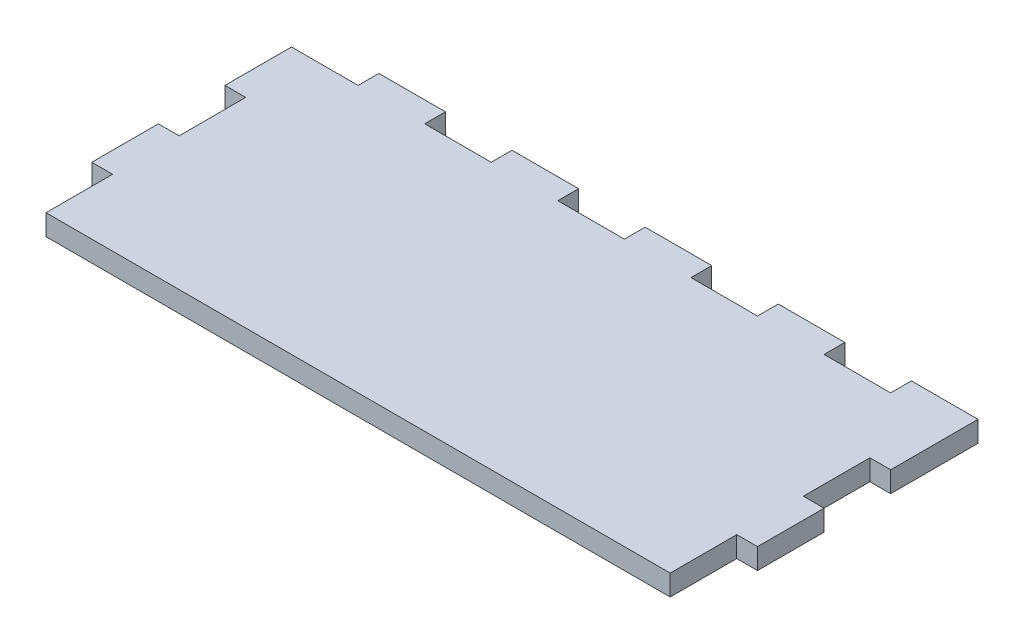
ISO-10303-21;
HEADER;
FILE_DESCRIPTION(('STEP AP214'),'2;1');
FILE_NAME('part.step','',(''),(''),'','','');
FILE_SCHEMA(('AUTOMOTIVE_DESIGN { 1 0 10303 214 1 1 1 1 }'));
ENDSEC;
DATA;
#1=APPLICATION_CONTEXT('core data for automotive mechanical design processes');
#2=APPLICATION_PROTOCOL_DEFINITION('international standard','automotive_design',2000,#1);
#3=PRODUCT_CONTEXT('',#1,'mechanical');
#4=PRODUCT('Part','Part','',(#3));
#5=PRODUCT_RELATED_PRODUCT_CATEGORY('part','',(#4));
#6=PRODUCT_DEFINITION_FORMATION('','',#4);
#7=PRODUCT_DEFINITION_CONTEXT('part definition',#1,'design');
#8=PRODUCT_DEFINITION('design','',#6,#7);
#9=PRODUCT_DEFINITION_SHAPE('','',#8);
#10=(LENGTH_UNIT() NAMED_UNIT(*) SI_UNIT(.MILLI.,.METRE.));
#11=(NAMED_UNIT(*) PLANE_ANGLE_UNIT() SI_UNIT($,.RADIAN.));
#12=(NAMED_UNIT(*) SI_UNIT($,.STERADIAN.) SOLID_ANGLE_UNIT());
#13=UNCERTAINTY_MEASURE_WITH_UNIT(LENGTH_MEASURE(1.E-05),#10,'distance_accuracy_value','');
#14=(GEOMETRIC_REPRESENTATION_CONTEXT(3) GLOBAL_UNCERTAINTY_ASSIGNED_CONTEXT((#13)) GLOBAL_UNIT_ASSIGNED_CONTEXT((#10,
#11,#12)) REPRESENTATION_CONTEXT('',''));
#15=CARTESIAN_POINT('',(0.,0.,0.));
#16=DIRECTION('',(0.,0.,1.));
#17=DIRECTION('',(1.,0.,0.));
#18=AXIS2_PLACEMENT_3D('',#15,#16,#17);
#19=CARTESIAN_POINT('',(0.,3.12,3.12));
#20=DIRECTION('',(-1.,0.,0.));
#21=DIRECTION('',(0.,0.,1.));
#22=AXIS2_PLACEMENT_3D('',#19,#20,#21);
#23=PLANE('',#22);
#24=DIRECTION('',(0.,0.,-1.));
#25=VECTOR('',#24,1.);
#26=CARTESIAN_POINT('',(0.,0.,3.12));
#27=LINE('',#26,#25);
#28=CARTESIAN_POINT('',(0.,0.,13.12));
#29=VERTEX_POINT('',#28);
#30=CARTESIAN_POINT('',(0.,0.,3.12));
#31=VERTEX_POINT('',#30);
#32=EDGE_CURVE('E285',#29,#31,#27,.T.);
#33=ORIENTED_EDGE('',*,*,#32,.F.);
#34=DIRECTION('',(0.,-1.,0.));
#35=VECTOR('',#34,1.);
#36=CARTESIAN_POINT('',(0.,3.12,13.12));
#37=LINE('',#36,#35);
#38=CARTESIAN_POINT('',(0.,3.12,13.12));
#39=VERTEX_POINT('',#38);
#40=EDGE_CURVE('E11',#39,#29,#37,.T.);
#41=ORIENTED_EDGE('',*,*,#40,.F.);
#42=DIRECTION('',(0.,0.,-1.));
#43=VECTOR('',#42,1.);
#44=CARTESIAN_POINT('',(0.,3.12,3.12));
#45=LINE('',#44,#43);
#46=CARTESIAN_POINT('',(0.,3.12,3.12));
#47=VERTEX_POINT('',#46);
#48=EDGE_CURVE('E383',#39,#47,#45,.T.);
#49=ORIENTED_EDGE('',*,*,#48,.T.);
#50=DIRECTION('',(0.,-1.,0.));
#51=VECTOR('',#50,1.);
#52=CARTESIAN_POINT('',(0.,3.12,3.12));
#53=LINE('',#52,#51);
#54=EDGE_CURVE('E35',#47,#31,#53,.T.);
#55=ORIENTED_EDGE('',*,*,#54,.T.);
#56=EDGE_LOOP('',(#33,#41,#49,#55));
#57=FACE_BOUND('',#56,.T.);
#58=ADVANCED_FACE('F32',(#57),#23,.T.);
#59=CARTESIAN_POINT('',(0.,3.12,13.12));
#60=DIRECTION('',(0.,0.,1.));
#61=DIRECTION('',(1.,0.,0.));
#62=AXIS2_PLACEMENT_3D('',#59,#60,#61);
#63=PLANE('',#62);
#64=DIRECTION('',(-1.,0.,0.));
#65=VECTOR('',#64,1.);
#66=CARTESIAN_POINT('',(0.,0.,13.12));
#67=LINE('',#66,#65);
#68=CARTESIAN_POINT('',(3.12,0.,13.12));
#69=VERTEX_POINT('',#68);
#70=EDGE_CURVE('E381',#69,#29,#67,.T.);
#71=ORIENTED_EDGE('',*,*,#70,.F.);
#72=DIRECTION('',(0.,-1.,0.));
#73=VECTOR('',#72,1.);
#74=CARTESIAN_POINT('',(3.12,3.12,13.12));
#75=LINE('',#74,#73);
#76=CARTESIAN_POINT('',(3.12,3.12,13.12));
#77=VERTEX_POINT('',#76);
#78=EDGE_CURVE('E41',#77,#69,#75,.T.);
#79=ORIENTED_EDGE('',*,*,#78,.F.);
#80=DIRECTION('',(-1.,0.,0.));
#81=VECTOR('',#80,1.);
#82=CARTESIAN_POINT('',(0.,3.12,13.12));
#83=LINE('',#82,#81);
#84=EDGE_CURVE('E275',#77,#39,#83,.T.);
#85=ORIENTED_EDGE('',*,*,#84,.T.);
#86=ORIENTED_EDGE('',*,*,#40,.T.);
#87=EDGE_LOOP('',(#71,#79,#85,#86));
#88=FACE_BOUND('',#87,.T.);
#89=ADVANCED_FACE('F448',(#88),#63,.T.);
#90=CARTESIAN_POINT('',(3.12,3.12,13.12));
#91=DIRECTION('',(-1.,0.,0.));
#92=DIRECTION('',(0.,0.,1.));
#93=AXIS2_PLACEMENT_3D('',#90,#91,#92);
#94=PLANE('',#93);
#95=DIRECTION('',(0.,0.,-1.));
#96=VECTOR('',#95,1.);
#97=CARTESIAN_POINT('',(3.12,0.,13.12));
#98=LINE('',#97,#96);
#99=CARTESIAN_POINT('',(3.12,0.,23.12));
#100=VERTEX_POINT('',#99);
#101=EDGE_CURVE('E262',#100,#69,#98,.T.);
#102=ORIENTED_EDGE('',*,*,#101,.F.);
#103=DIRECTION('',(0.,-1.,0.));
#104=VECTOR('',#103,1.);
#105=CARTESIAN_POINT('',(3.12,3.12,23.12));
#106=LINE('',#105,#104);
#107=CARTESIAN_POINT('',(3.12,3.12,23.12));
#108=VERTEX_POINT('',#107);
#109=EDGE_CURVE('E257',#108,#100,#106,.T.);
#110=ORIENTED_EDGE('',*,*,#109,.F.);
#111=DIRECTION('',(0.,0.,-1.));
#112=VECTOR('',#111,1.);
#113=CARTESIAN_POINT('',(3.12,3.12,13.12));
#114=LINE('',#113,#112);
#115=EDGE_CURVE('E260',#108,#77,#114,.T.);
#116=ORIENTED_EDGE('',*,*,#115,.T.);
#117=ORIENTED_EDGE('',*,*,#78,.T.);
#118=EDGE_LOOP('',(#102,#110,#116,#117));
#119=FACE_BOUND('',#118,.T.);
#120=ADVANCED_FACE('F259',(#119),#94,.T.);
#121=CARTESIAN_POINT('',(3.12,3.12,23.12));
#122=DIRECTION('',(0.,0.,-1.));
#123=DIRECTION('',(-1.,0.,0.));
#124=AXIS2_PLACEMENT_3D('',#121,#122,#123);
#125=PLANE('',#124);
#126=DIRECTION('',(1.,0.,0.));
#127=VECTOR('',#126,1.);
#128=CARTESIAN_POINT('',(3.12,0.,23.12));
#129=LINE('',#128,#127);
#130=CARTESIAN_POINT('',(0.,0.,23.12));
#131=VERTEX_POINT('',#130);
#132=EDGE_CURVE('E378',#131,#100,#129,.T.);
#133=ORIENTED_EDGE('',*,*,#132,.F.);
#134=DIRECTION('',(0.,-1.,0.));
#135=VECTOR('',#134,1.);
#136=CARTESIAN_POINT('',(0.,3.12,23.12));
#137=LINE('',#136,#135);
#138=CARTESIAN_POINT('',(0.,3.12,23.12));
#139=VERTEX_POINT('',#138);
#140=EDGE_CURVE('E267',#139,#131,#137,.T.);
#141=ORIENTED_EDGE('',*,*,#140,.F.);
#142=DIRECTION('',(1.,0.,0.));
#143=VECTOR('',#142,1.);
#144=CARTESIAN_POINT('',(3.12,3.12,23.12));
#145=LINE('',#144,#143);
#146=EDGE_CURVE('E273',#139,#108,#145,.T.);
#147=ORIENTED_EDGE('',*,*,#146,.T.);
#148=ORIENTED_EDGE('',*,*,#109,.T.);
#149=EDGE_LOOP('',(#133,#141,#147,#148));
#150=FACE_BOUND('',#149,.T.);
#151=ADVANCED_FACE('F277',(#150),#125,.T.);
#152=CARTESIAN_POINT('',(0.,3.12,23.12));
#153=DIRECTION('',(-1.,0.,0.));
#154=DIRECTION('',(0.,0.,1.));
#155=AXIS2_PLACEMENT_3D('',#152,#153,#154);
#156=PLANE('',#155);
#157=DIRECTION('',(0.,0.,-1.));
#158=VECTOR('',#157,1.);
#159=CARTESIAN_POINT('',(0.,0.,23.12));
#160=LINE('',#159,#158);
#161=CARTESIAN_POINT('',(0.,0.,33.12));
#162=VERTEX_POINT('',#161);
#163=EDGE_CURVE('E375',#162,#131,#160,.T.);
#164=ORIENTED_EDGE('',*,*,#163,.F.);
#165=DIRECTION('',(0.,-1.,0.));
#166=VECTOR('',#165,1.);
#167=CARTESIAN_POINT('',(0.,3.12,33.12));
#168=LINE('',#167,#166);
#169=CARTESIAN_POINT('',(0.,3.12,33.12));
#170=VERTEX_POINT('',#169);
#171=EDGE_CURVE('E387',#170,#162,#168,.T.);
#172=ORIENTED_EDGE('',*,*,#171,.F.);
#173=DIRECTION('',(0.,0.,-1.));
#174=VECTOR('',#173,1.);
#175=CARTESIAN_POINT('',(0.,3.12,23.12));
#176=LINE('',#175,#174);
#177=EDGE_CURVE('E278',#170,#139,#176,.T.);
#178=ORIENTED_EDGE('',*,*,#177,.T.);
#179=ORIENTED_EDGE('',*,*,#140,.T.);
#180=EDGE_LOOP('',(#164,#172,#178,#179));
#181=FACE_BOUND('',#180,.T.);
#182=ADVANCED_FACE('F461',(#181),#156,.T.);
#183=CARTESIAN_POINT('',(0.,3.12,33.12));
#184=DIRECTION('',(0.,0.,1.));
#185=DIRECTION('',(1.,0.,0.));
#186=AXIS2_PLACEMENT_3D('',#183,#184,#185);
#187=PLANE('',#186);
#188=DIRECTION('',(-1.,0.,0.));
#189=VECTOR('',#188,1.);
#190=CARTESIAN_POINT('',(0.,0.,33.12));
#191=LINE('',#190,#189);
#192=CARTESIAN_POINT('',(3.12,0.,33.12));
#193=VERTEX_POINT('',#192);
#194=EDGE_CURVE('E372',#193,#162,#191,.T.);
#195=ORIENTED_EDGE('',*,*,#194,.F.);
#196=DIRECTION('',(0.,-1.,0.));
#197=VECTOR('',#196,1.);
#198=CARTESIAN_POINT('',(3.12,3.12,33.12));
#199=LINE('',#198,#197);
#200=CARTESIAN_POINT('',(3.12,3.12,33.12));
#201=VERTEX_POINT('',#200);
#202=EDGE_CURVE('E389',#201,#193,#199,.T.);
#203=ORIENTED_EDGE('',*,*,#202,.F.);
#204=DIRECTION('',(-1.,0.,0.));
#205=VECTOR('',#204,1.);
#206=CARTESIAN_POINT('',(0.,3.12,33.12));
#207=LINE('',#206,#205);
#208=EDGE_CURVE('E280',#201,#170,#207,.T.);
#209=ORIENTED_EDGE('',*,*,#208,.T.);
#210=ORIENTED_EDGE('',*,*,#171,.T.);
#211=EDGE_LOOP('',(#195,#203,#209,#210));
#212=FACE_BOUND('',#211,.T.);
#213=ADVANCED_FACE('F464',(#212),#187,.T.);
#214=CARTESIAN_POINT('',(3.12,3.12,33.12));
#215=DIRECTION('',(-1.,0.,0.));
#216=DIRECTION('',(0.,0.,1.));
#217=AXIS2_PLACEMENT_3D('',#214,#215,#216);
#218=PLANE('',#217);
#219=DIRECTION('',(0.,0.,-1.));
#220=VECTOR('',#219,1.);
#221=CARTESIAN_POINT('',(3.12,0.,33.12));
#222=LINE('',#221,#220);
#223=CARTESIAN_POINT('',(3.12,0.,43.12));
#224=VERTEX_POINT('',#223);
#225=EDGE_CURVE('E369',#224,#193,#222,.T.);
#226=ORIENTED_EDGE('',*,*,#225,.F.);
#227=DIRECTION('',(0.,-1.,0.));
#228=VECTOR('',#227,1.);
#229=CARTESIAN_POINT('',(3.12,3.12,43.12));
#230=LINE('',#229,#228);
#231=CARTESIAN_POINT('',(3.12,3.12,43.12));
#232=VERTEX_POINT('',#231);
#233=EDGE_CURVE('E391',#232,#224,#230,.T.);
#234=ORIENTED_EDGE('',*,*,#233,.F.);
#235=DIRECTION('',(0.,0.,-1.));
#236=VECTOR('',#235,1.);
#237=CARTESIAN_POINT('',(3.12,3.12,33.12));
#238=LINE('',#237,#236);
#239=EDGE_CURVE('E891',#232,#201,#238,.T.);
#240=ORIENTED_EDGE('',*,*,#239,.T.);
#241=ORIENTED_EDGE('',*,*,#202,.T.);
#242=EDGE_LOOP('',(#226,#234,#240,#241));
#243=FACE_BOUND('',#242,.T.);
#244=ADVANCED_FACE('F468',(#243),#218,.T.);
#245=CARTESIAN_POINT('',(3.12,3.12,43.12));
#246=DIRECTION('',(0.,0.,1.));
#247=DIRECTION('',(1.,0.,0.));
#248=AXIS2_PLACEMENT_3D('',#245,#246,#247);
#249=PLANE('',#248);
#250=DIRECTION('',(-1.,0.,0.));
#251=VECTOR('',#250,1.);
#252=CARTESIAN_POINT('',(3.12,0.,43.12));
#253=LINE('',#252,#251);
#254=CARTESIAN_POINT('',(96.88,0.,43.12));
#255=VERTEX_POINT('',#254);
#256=EDGE_CURVE('E366',#255,#224,#253,.T.);
#257=ORIENTED_EDGE('',*,*,#256,.F.);
#258=DIRECTION('',(0.,-1.,0.));
#259=VECTOR('',#258,1.);
#260=CARTESIAN_POINT('',(96.88,3.12,43.12));
#261=LINE('',#260,#259);
#262=CARTESIAN_POINT('',(96.88,3.12,43.12));
#263=VERTEX_POINT('',#262);
#264=EDGE_CURVE('E393',#263,#255,#261,.T.);
#265=ORIENTED_EDGE('',*,*,#264,.F.);
#266=DIRECTION('',(-1.,0.,0.));
#267=VECTOR('',#266,1.);
#268=CARTESIAN_POINT('',(3.12,3.12,43.12));
#269=LINE('',#268,#267);
#270=EDGE_CURVE('E888',#263,#232,#269,.T.);
#271=ORIENTED_EDGE('',*,*,#270,.T.);
#272=ORIENTED_EDGE('',*,*,#233,.T.);
#273=EDGE_LOOP('',(#257,#265,#271,#272));
#274=FACE_BOUND('',#273,.T.);
#275=ADVANCED_FACE('F472',(#274),#249,.T.);
#276=CARTESIAN_POINT('',(96.88,3.12,33.12));
#277=DIRECTION('',(1.,0.,0.));
#278=DIRECTION('',(0.,0.,-1.));
#279=AXIS2_PLACEMENT_3D('',#276,#277,#278);
#280=PLANE('',#279);
#281=DIRECTION('',(0.,0.,1.));
#282=VECTOR('',#281,1.);
#283=CARTESIAN_POINT('',(96.88,0.,33.12));
#284=LINE('',#283,#282);
#285=CARTESIAN_POINT('',(96.88,0.,33.12));
#286=VERTEX_POINT('',#285);
#287=EDGE_CURVE('E363',#286,#255,#284,.T.);
#288=ORIENTED_EDGE('',*,*,#287,.F.);
#289=DIRECTION('',(0.,-1.,0.));
#290=VECTOR('',#289,1.);
#291=CARTESIAN_POINT('',(96.88,3.12,33.12));
#292=LINE('',#291,#290);
#293=CARTESIAN_POINT('',(96.88,3.12,33.12));
#294=VERTEX_POINT('',#293);
#295=EDGE_CURVE('E395',#294,#286,#292,.T.);
#296=ORIENTED_EDGE('',*,*,#295,.F.);
#297=DIRECTION('',(0.,0.,1.));
#298=VECTOR('',#297,1.);
#299=CARTESIAN_POINT('',(96.88,3.12,33.12));
#300=LINE('',#299,#298);
#301=EDGE_CURVE('E885',#294,#263,#300,.T.);
#302=ORIENTED_EDGE('',*,*,#301,.T.);
#303=ORIENTED_EDGE('',*,*,#264,.T.);
#304=EDGE_LOOP('',(#288,#296,#302,#303));
#305=FACE_BOUND('',#304,.T.);
#306=ADVANCED_FACE('F476',(#305),#280,.T.);
#307=CARTESIAN_POINT('',(100.,3.12,33.12));
#308=DIRECTION('',(0.,0.,1.));
#309=DIRECTION('',(1.,0.,0.));
#310=AXIS2_PLACEMENT_3D('',#307,#308,#309);
#311=PLANE('',#310);
#312=DIRECTION('',(-1.,0.,0.));
#313=VECTOR('',#312,1.);
#314=CARTESIAN_POINT('',(100.,0.,33.12));
#315=LINE('',#314,#313);
#316=CARTESIAN_POINT('',(100.,0.,33.12));
#317=VERTEX_POINT('',#316);
#318=EDGE_CURVE('E360',#317,#286,#315,.T.);
#319=ORIENTED_EDGE('',*,*,#318,.F.);
#320=DIRECTION('',(0.,-1.,0.));
#321=VECTOR('',#320,1.);
#322=CARTESIAN_POINT('',(100.,3.12,33.12));
#323=LINE('',#322,#321);
#324=CARTESIAN_POINT('',(100.,3.12,33.12));
#325=VERTEX_POINT('',#324);
#326=EDGE_CURVE('E397',#325,#317,#323,.T.);
#327=ORIENTED_EDGE('',*,*,#326,.F.);
#328=DIRECTION('',(-1.,0.,0.));
#329=VECTOR('',#328,1.);
#330=CARTESIAN_POINT('',(100.,3.12,33.12));
#331=LINE('',#330,#329);
#332=EDGE_CURVE('E882',#325,#294,#331,.T.);
#333=ORIENTED_EDGE('',*,*,#332,.T.);
#334=ORIENTED_EDGE('',*,*,#295,.T.);
#335=EDGE_LOOP('',(#319,#327,#333,#334));
#336=FACE_BOUND('',#335,.T.);
#337=ADVANCED_FACE('F480',(#336),#311,.T.);
#338=CARTESIAN_POINT('',(100.,3.12,23.12));
#339=DIRECTION('',(1.,0.,0.));
#340=DIRECTION('',(0.,0.,-1.));
#341=AXIS2_PLACEMENT_3D('',#338,#339,#340);
#342=PLANE('',#341);
#343=DIRECTION('',(0.,0.,1.));
#344=VECTOR('',#343,1.);
#345=CARTESIAN_POINT('',(100.,0.,23.12));
#346=LINE('',#345,#344);
#347=CARTESIAN_POINT('',(100.,0.,23.12));
#348=VERTEX_POINT('',#347);
#349=EDGE_CURVE('E357',#348,#317,#346,.T.);
#350=ORIENTED_EDGE('',*,*,#349,.F.);
#351=DIRECTION('',(0.,-1.,0.));
#352=VECTOR('',#351,1.);
#353=CARTESIAN_POINT('',(100.,3.12,23.12));
#354=LINE('',#353,#352);
#355=CARTESIAN_POINT('',(100.,3.12,23.12));
#356=VERTEX_POINT('',#355);
#357=EDGE_CURVE('E399',#356,#348,#354,.T.);
#358=ORIENTED_EDGE('',*,*,#357,.F.);
#359=DIRECTION('',(0.,0.,1.));
#360=VECTOR('',#359,1.);
#361=CARTESIAN_POINT('',(100.,3.12,23.12));
#362=LINE('',#361,#360);
#363=EDGE_CURVE('E879',#356,#325,#362,.T.);
#364=ORIENTED_EDGE('',*,*,#363,.T.);
#365=ORIENTED_EDGE('',*,*,#326,.T.);
#366=EDGE_LOOP('',(#350,#358,#364,#365));
#367=FACE_BOUND('',#366,.T.);
#368=ADVANCED_FACE('F484',(#367),#342,.T.);
#369=CARTESIAN_POINT('',(96.88,3.12,23.12));
#370=DIRECTION('',(0.,0.,-1.));
#371=DIRECTION('',(-1.,0.,0.));
#372=AXIS2_PLACEMENT_3D('',#369,#370,#371);
#373=PLANE('',#372);
#374=DIRECTION('',(1.,0.,0.));
#375=VECTOR('',#374,1.);
#376=CARTESIAN_POINT('',(96.88,0.,23.12));
#377=LINE('',#376,#375);
#378=CARTESIAN_POINT('',(96.88,0.,23.12));
#379=VERTEX_POINT('',#378);
#380=EDGE_CURVE('E354',#379,#348,#377,.T.);
#381=ORIENTED_EDGE('',*,*,#380,.F.);
#382=DIRECTION('',(0.,-1.,0.));
#383=VECTOR('',#382,1.);
#384=CARTESIAN_POINT('',(96.88,3.12,23.12));
#385=LINE('',#384,#383);
#386=CARTESIAN_POINT('',(96.88,3.12,23.12));
#387=VERTEX_POINT('',#386);
#388=EDGE_CURVE('E401',#387,#379,#385,.T.);
#389=ORIENTED_EDGE('',*,*,#388,.F.);
#390=DIRECTION('',(1.,0.,0.));
#391=VECTOR('',#390,1.);
#392=CARTESIAN_POINT('',(96.88,3.12,23.12));
#393=LINE('',#392,#391);
#394=EDGE_CURVE('E876',#387,#356,#393,.T.);
#395=ORIENTED_EDGE('',*,*,#394,.T.);
#396=ORIENTED_EDGE('',*,*,#357,.T.);
#397=EDGE_LOOP('',(#381,#389,#395,#396));
#398=FACE_BOUND('',#397,.T.);
#399=ADVANCED_FACE('F488',(#398),#373,.T.);
#400=CARTESIAN_POINT('',(96.88,3.12,13.12));
#401=DIRECTION('',(1.,0.,0.));
#402=DIRECTION('',(0.,0.,-1.));
#403=AXIS2_PLACEMENT_3D('',#400,#401,#402);
#404=PLANE('',#403);
#405=DIRECTION('',(0.,0.,1.));
#406=VECTOR('',#405,1.);
#407=CARTESIAN_POINT('',(96.88,0.,13.12));
#408=LINE('',#407,#406);
#409=CARTESIAN_POINT('',(96.88,0.,13.12));
#410=VERTEX_POINT('',#409);
#411=EDGE_CURVE('E351',#410,#379,#408,.T.);
#412=ORIENTED_EDGE('',*,*,#411,.F.);
#413=DIRECTION('',(0.,-1.,0.));
#414=VECTOR('',#413,1.);
#415=CARTESIAN_POINT('',(96.88,3.12,13.12));
#416=LINE('',#415,#414);
#417=CARTESIAN_POINT('',(96.88,3.12,13.12));
#418=VERTEX_POINT('',#417);
#419=EDGE_CURVE('E403',#418,#410,#416,.T.);
#420=ORIENTED_EDGE('',*,*,#419,.F.);
#421=DIRECTION('',(0.,0.,1.));
#422=VECTOR('',#421,1.);
#423=CARTESIAN_POINT('',(96.88,3.12,13.12));
#424=LINE('',#423,#422);
#425=EDGE_CURVE('E869',#418,#387,#424,.T.);
#426=ORIENTED_EDGE('',*,*,#425,.T.);
#427=ORIENTED_EDGE('',*,*,#388,.T.);
#428=EDGE_LOOP('',(#412,#420,#426,#427));
#429=FACE_BOUND('',#428,.T.);
#430=ADVANCED_FACE('F492',(#429),#404,.T.);
#431=CARTESIAN_POINT('',(100.,3.12,13.12));
#432=DIRECTION('',(0.,0.,1.));
#433=DIRECTION('',(1.,0.,0.));
#434=AXIS2_PLACEMENT_3D('',#431,#432,#433);
#435=PLANE('',#434);
#436=DIRECTION('',(-1.,0.,0.));
#437=VECTOR('',#436,1.);
#438=CARTESIAN_POINT('',(100.,0.,13.12));
#439=LINE('',#438,#437);
#440=CARTESIAN_POINT('',(100.,0.,13.12));
#441=VERTEX_POINT('',#440);
#442=EDGE_CURVE('E348',#441,#410,#439,.T.);
#443=ORIENTED_EDGE('',*,*,#442,.F.);
#444=DIRECTION('',(0.,-1.,0.));
#445=VECTOR('',#444,1.);
#446=CARTESIAN_POINT('',(100.,3.12,13.12));
#447=LINE('',#446,#445);
#448=CARTESIAN_POINT('',(100.,3.12,13.12));
#449=VERTEX_POINT('',#448);
#450=EDGE_CURVE('E405',#449,#441,#447,.T.);
#451=ORIENTED_EDGE('',*,*,#450,.F.);
#452=DIRECTION('',(-1.,0.,0.));
#453=VECTOR('',#452,1.);
#454=CARTESIAN_POINT('',(100.,3.12,13.12));
#455=LINE('',#454,#453);
#456=EDGE_CURVE('E867',#449,#418,#455,.T.);
#457=ORIENTED_EDGE('',*,*,#456,.T.);
#458=ORIENTED_EDGE('',*,*,#419,.T.);
#459=EDGE_LOOP('',(#443,#451,#457,#458));
#460=FACE_BOUND('',#459,.T.);
#461=ADVANCED_FACE('F496',(#460),#435,.T.);
#462=CARTESIAN_POINT('',(100.,3.12,3.12));
#463=DIRECTION('',(1.,0.,0.));
#464=DIRECTION('',(0.,0.,-1.));
#465=AXIS2_PLACEMENT_3D('',#462,#463,#464);
#466=PLANE('',#465);
#467=DIRECTION('',(0.,0.,1.));
#468=VECTOR('',#467,1.);
#469=CARTESIAN_POINT('',(100.,0.,3.12));
#470=LINE('',#469,#468);
#471=CARTESIAN_POINT('',(100.,0.,0.));
#472=VERTEX_POINT('',#471);
#473=EDGE_CURVE('E345',#472,#441,#470,.T.);
#474=ORIENTED_EDGE('',*,*,#473,.F.);
#475=DIRECTION('',(0.,-1.,0.));
#476=VECTOR('',#475,1.);
#477=CARTESIAN_POINT('',(100.,3.12,0.));
#478=LINE('',#477,#476);
#479=CARTESIAN_POINT('',(100.,3.12,0.));
#480=VERTEX_POINT('',#479);
#481=EDGE_CURVE('E407',#480,#472,#478,.T.);
#482=ORIENTED_EDGE('',*,*,#481,.F.);
#483=DIRECTION('',(0.,0.,1.));
#484=VECTOR('',#483,1.);
#485=CARTESIAN_POINT('',(100.,3.12,0.));
#486=LINE('',#485,#484);
#487=EDGE_CURVE('E862',#480,#449,#486,.T.);
#488=ORIENTED_EDGE('',*,*,#487,.T.);
#489=ORIENTED_EDGE('',*,*,#450,.T.);
#490=EDGE_LOOP('',(#474,#482,#488,#489));
#491=FACE_BOUND('',#490,.T.);
#492=ADVANCED_FACE('F500',(#491),#466,.T.);
#493=CARTESIAN_POINT('',(90.,3.12,0.));
#494=DIRECTION('',(0.,0.,-1.));
#495=DIRECTION('',(-1.,0.,0.));
#496=AXIS2_PLACEMENT_3D('',#493,#494,#495);
#497=PLANE('',#496);
#498=DIRECTION('',(1.,0.,0.));
#499=VECTOR('',#498,1.);
#500=CARTESIAN_POINT('',(90.,0.,0.));
#501=LINE('',#500,#499);
#502=CARTESIAN_POINT('',(90.,0.,0.));
#503=VERTEX_POINT('',#502);
#504=EDGE_CURVE('E342',#503,#472,#501,.T.);
#505=ORIENTED_EDGE('',*,*,#504,.F.);
#506=DIRECTION('',(0.,-1.,0.));
#507=VECTOR('',#506,1.);
#508=CARTESIAN_POINT('',(90.,3.12,0.));
#509=LINE('',#508,#507);
#510=CARTESIAN_POINT('',(90.,3.12,0.));
#511=VERTEX_POINT('',#510);
#512=EDGE_CURVE('E410',#511,#503,#509,.T.);
#513=ORIENTED_EDGE('',*,*,#512,.F.);
#514=DIRECTION('',(1.,0.,0.));
#515=VECTOR('',#514,1.);
#516=CARTESIAN_POINT('',(90.,3.12,0.));
#517=LINE('',#516,#515);
#518=EDGE_CURVE('E860',#511,#480,#517,.T.);
#519=ORIENTED_EDGE('',*,*,#518,.T.);
#520=ORIENTED_EDGE('',*,*,#481,.T.);
#521=EDGE_LOOP('',(#505,#513,#519,#520));
#522=FACE_BOUND('',#521,.T.);
#523=ADVANCED_FACE('F504',(#522),#497,.T.);
#524=CARTESIAN_POINT('',(90.,3.12,3.12));
#525=DIRECTION('',(-1.,0.,0.));
#526=DIRECTION('',(0.,0.,1.));
#527=AXIS2_PLACEMENT_3D('',#524,#525,#526);
#528=PLANE('',#527);
#529=DIRECTION('',(0.,0.,-1.));
#530=VECTOR('',#529,1.);
#531=CARTESIAN_POINT('',(90.,0.,3.12));
#532=LINE('',#531,#530);
#533=CARTESIAN_POINT('',(90.,0.,3.12));
#534=VERTEX_POINT('',#533);
#535=EDGE_CURVE('E339',#534,#503,#532,.T.);
#536=ORIENTED_EDGE('',*,*,#535,.F.);
#537=DIRECTION('',(0.,-1.,0.));
#538=VECTOR('',#537,1.);
#539=CARTESIAN_POINT('',(90.,3.12,3.12));
#540=LINE('',#539,#538);
#541=CARTESIAN_POINT('',(90.,3.12,3.12));
#542=VERTEX_POINT('',#541);
#543=EDGE_CURVE('E412',#542,#534,#540,.T.);
#544=ORIENTED_EDGE('',*,*,#543,.F.);
#545=DIRECTION('',(0.,0.,-1.));
#546=VECTOR('',#545,1.);
#547=CARTESIAN_POINT('',(90.,3.12,3.12));
#548=LINE('',#547,#546);
#549=EDGE_CURVE('E857',#542,#511,#548,.T.);
#550=ORIENTED_EDGE('',*,*,#549,.T.);
#551=ORIENTED_EDGE('',*,*,#512,.T.);
#552=EDGE_LOOP('',(#536,#544,#550,#551));
#553=FACE_BOUND('',#552,.T.);
#554=ADVANCED_FACE('F508',(#553),#528,.T.);
#555=CARTESIAN_POINT('',(80.,3.12,3.12));
#556=DIRECTION('',(0.,0.,-1.));
#557=DIRECTION('',(-1.,0.,0.));
#558=AXIS2_PLACEMENT_3D('',#555,#556,#557);
#559=PLANE('',#558);
#560=DIRECTION('',(1.,0.,0.));
#561=VECTOR('',#560,1.);
#562=CARTESIAN_POINT('',(80.,0.,3.12));
#563=LINE('',#562,#561);
#564=CARTESIAN_POINT('',(80.,0.,3.12));
#565=VERTEX_POINT('',#564);
#566=EDGE_CURVE('E336',#565,#534,#563,.T.);
#567=ORIENTED_EDGE('',*,*,#566,.F.);
#568=DIRECTION('',(0.,-1.,0.));
#569=VECTOR('',#568,1.);
#570=CARTESIAN_POINT('',(80.,3.12,3.12));
#571=LINE('',#570,#569);
#572=CARTESIAN_POINT('',(80.,3.12,3.12));
#573=VERTEX_POINT('',#572);
#574=EDGE_CURVE('E414',#573,#565,#571,.T.);
#575=ORIENTED_EDGE('',*,*,#574,.F.);
#576=DIRECTION('',(1.,0.,0.));
#577=VECTOR('',#576,1.);
#578=CARTESIAN_POINT('',(80.,3.12,3.12));
#579=LINE('',#578,#577);
#580=EDGE_CURVE('E912',#573,#542,#579,.T.);
#581=ORIENTED_EDGE('',*,*,#580,.T.);
#582=ORIENTED_EDGE('',*,*,#543,.T.);
#583=EDGE_LOOP('',(#567,#575,#581,#582));
#584=FACE_BOUND('',#583,.T.);
#585=ADVANCED_FACE('F512',(#584),#559,.T.);
#586=CARTESIAN_POINT('',(80.,3.12,0.));
#587=DIRECTION('',(1.,0.,0.));
#588=DIRECTION('',(0.,0.,-1.));
#589=AXIS2_PLACEMENT_3D('',#586,#587,#588);
#590=PLANE('',#589);
#591=DIRECTION('',(0.,0.,1.));
#592=VECTOR('',#591,1.);
#593=CARTESIAN_POINT('',(80.,0.,0.));
#594=LINE('',#593,#592);
#595=CARTESIAN_POINT('',(80.,0.,0.));
#596=VERTEX_POINT('',#595);
#597=EDGE_CURVE('E333',#596,#565,#594,.T.);
#598=ORIENTED_EDGE('',*,*,#597,.F.);
#599=DIRECTION('',(0.,-1.,0.));
#600=VECTOR('',#599,1.);
#601=CARTESIAN_POINT('',(80.,3.12,0.));
#602=LINE('',#601,#600);
#603=CARTESIAN_POINT('',(80.,3.12,0.));
#604=VERTEX_POINT('',#603);
#605=EDGE_CURVE('E416',#604,#596,#602,.T.);
#606=ORIENTED_EDGE('',*,*,#605,.F.);
#607=DIRECTION('',(0.,0.,1.));
#608=VECTOR('',#607,1.);
#609=CARTESIAN_POINT('',(80.,3.12,0.));
#610=LINE('',#609,#608);
#611=EDGE_CURVE('E850',#604,#573,#610,.T.);
#612=ORIENTED_EDGE('',*,*,#611,.T.);
#613=ORIENTED_EDGE('',*,*,#574,.T.);
#614=EDGE_LOOP('',(#598,#606,#612,#613));
#615=FACE_BOUND('',#614,.T.);
#616=ADVANCED_FACE('F516',(#615),#590,.T.);
#617=CARTESIAN_POINT('',(70.,3.12,0.));
#618=DIRECTION('',(0.,0.,-1.));
#619=DIRECTION('',(-1.,0.,0.));
#620=AXIS2_PLACEMENT_3D('',#617,#618,#619);
#621=PLANE('',#620);
#622=DIRECTION('',(1.,0.,0.));
#623=VECTOR('',#622,1.);
#624=CARTESIAN_POINT('',(70.,0.,0.));
#625=LINE('',#624,#623);
#626=CARTESIAN_POINT('',(70.,0.,0.));
#627=VERTEX_POINT('',#626);
#628=EDGE_CURVE('E330',#627,#596,#625,.T.);
#629=ORIENTED_EDGE('',*,*,#628,.F.);
#630=DIRECTION('',(0.,-1.,0.));
#631=VECTOR('',#630,1.);
#632=CARTESIAN_POINT('',(70.,3.12,0.));
#633=LINE('',#632,#631);
#634=CARTESIAN_POINT('',(70.,3.12,0.));
#635=VERTEX_POINT('',#634);
#636=EDGE_CURVE('E418',#635,#627,#633,.T.);
#637=ORIENTED_EDGE('',*,*,#636,.F.);
#638=DIRECTION('',(1.,0.,0.));
#639=VECTOR('',#638,1.);
#640=CARTESIAN_POINT('',(70.,3.12,0.));
#641=LINE('',#640,#639);
#642=EDGE_CURVE('E846',#635,#604,#641,.T.);
#643=ORIENTED_EDGE('',*,*,#642,.T.);
#644=ORIENTED_EDGE('',*,*,#605,.T.);
#645=EDGE_LOOP('',(#629,#637,#643,#644));
#646=FACE_BOUND('',#645,.T.);
#647=ADVANCED_FACE('F520',(#646),#621,.T.);
#648=CARTESIAN_POINT('',(70.,3.12,3.12));
#649=DIRECTION('',(-1.,0.,0.));
#650=DIRECTION('',(0.,0.,1.));
#651=AXIS2_PLACEMENT_3D('',#648,#649,#650);
#652=PLANE('',#651);
#653=DIRECTION('',(0.,0.,-1.));
#654=VECTOR('',#653,1.);
#655=CARTESIAN_POINT('',(70.,0.,3.12));
#656=LINE('',#655,#654);
#657=CARTESIAN_POINT('',(70.,0.,3.12));
#658=VERTEX_POINT('',#657);
#659=EDGE_CURVE('E327',#658,#627,#656,.T.);
#660=ORIENTED_EDGE('',*,*,#659,.F.);
#661=DIRECTION('',(0.,-1.,0.));
#662=VECTOR('',#661,1.);
#663=CARTESIAN_POINT('',(70.,3.12,3.12));
#664=LINE('',#663,#662);
#665=CARTESIAN_POINT('',(70.,3.12,3.12));
#666=VERTEX_POINT('',#665);
#667=EDGE_CURVE('E420',#666,#658,#664,.T.);
#668=ORIENTED_EDGE('',*,*,#667,.F.);
#669=DIRECTION('',(0.,0.,-1.));
#670=VECTOR('',#669,1.);
#671=CARTESIAN_POINT('',(70.,3.12,3.12));
#672=LINE('',#671,#670);
#673=EDGE_CURVE('E916',#666,#635,#672,.T.);
#674=ORIENTED_EDGE('',*,*,#673,.T.);
#675=ORIENTED_EDGE('',*,*,#636,.T.);
#676=EDGE_LOOP('',(#660,#668,#674,#675));
#677=FACE_BOUND('',#676,.T.);
#678=ADVANCED_FACE('F524',(#677),#652,.T.);
#679=CARTESIAN_POINT('',(60.,3.12,3.12));
#680=DIRECTION('',(0.,0.,-1.));
#681=DIRECTION('',(-1.,0.,0.));
#682=AXIS2_PLACEMENT_3D('',#679,#680,#681);
#683=PLANE('',#682);
#684=DIRECTION('',(1.,0.,0.));
#685=VECTOR('',#684,1.);
#686=CARTESIAN_POINT('',(60.,0.,3.12));
#687=LINE('',#686,#685);
#688=CARTESIAN_POINT('',(60.,0.,3.12));
#689=VERTEX_POINT('',#688);
#690=EDGE_CURVE('E324',#689,#658,#687,.T.);
#691=ORIENTED_EDGE('',*,*,#690,.F.);
#692=DIRECTION('',(0.,-1.,0.));
#693=VECTOR('',#692,1.);
#694=CARTESIAN_POINT('',(60.,3.12,3.12));
#695=LINE('',#694,#693);
#696=CARTESIAN_POINT('',(60.,3.12,3.12));
#697=VERTEX_POINT('',#696);
#698=EDGE_CURVE('E422',#697,#689,#695,.T.);
#699=ORIENTED_EDGE('',*,*,#698,.F.);
#700=DIRECTION('',(1.,0.,0.));
#701=VECTOR('',#700,1.);
#702=CARTESIAN_POINT('',(60.,3.12,3.12));
#703=LINE('',#702,#701);
#704=EDGE_CURVE('E839',#697,#666,#703,.T.);
#705=ORIENTED_EDGE('',*,*,#704,.T.);
#706=ORIENTED_EDGE('',*,*,#667,.T.);
#707=EDGE_LOOP('',(#691,#699,#705,#706));
#708=FACE_BOUND('',#707,.T.);
#709=ADVANCED_FACE('F528',(#708),#683,.T.);
#710=CARTESIAN_POINT('',(60.,3.12,0.));
#711=DIRECTION('',(1.,0.,0.));
#712=DIRECTION('',(0.,0.,-1.));
#713=AXIS2_PLACEMENT_3D('',#710,#711,#712);
#714=PLANE('',#713);
#715=DIRECTION('',(0.,0.,1.));
#716=VECTOR('',#715,1.);
#717=CARTESIAN_POINT('',(60.,0.,0.));
#718=LINE('',#717,#716);
#719=CARTESIAN_POINT('',(60.,0.,0.));
#720=VERTEX_POINT('',#719);
#721=EDGE_CURVE('E321',#720,#689,#718,.T.);
#722=ORIENTED_EDGE('',*,*,#721,.F.);
#723=DIRECTION('',(0.,-1.,0.));
#724=VECTOR('',#723,1.);
#725=CARTESIAN_POINT('',(60.,3.12,0.));
#726=LINE('',#725,#724);
#727=CARTESIAN_POINT('',(60.,3.12,0.));
#728=VERTEX_POINT('',#727);
#729=EDGE_CURVE('E424',#728,#720,#726,.T.);
#730=ORIENTED_EDGE('',*,*,#729,.F.);
#731=DIRECTION('',(0.,0.,1.));
#732=VECTOR('',#731,1.);
#733=CARTESIAN_POINT('',(60.,3.12,0.));
#734=LINE('',#733,#732);
#735=EDGE_CURVE('E835',#728,#697,#734,.T.);
#736=ORIENTED_EDGE('',*,*,#735,.T.);
#737=ORIENTED_EDGE('',*,*,#698,.T.);
#738=EDGE_LOOP('',(#722,#730,#736,#737));
#739=FACE_BOUND('',#738,.T.);
#740=ADVANCED_FACE('F532',(#739),#714,.T.);
#741=CARTESIAN_POINT('',(50.,3.12,0.));
#742=DIRECTION('',(0.,0.,-1.));
#743=DIRECTION('',(-1.,0.,0.));
#744=AXIS2_PLACEMENT_3D('',#741,#742,#743);
#745=PLANE('',#744);
#746=DIRECTION('',(1.,0.,0.));
#747=VECTOR('',#746,1.);
#748=CARTESIAN_POINT('',(50.,0.,0.));
#749=LINE('',#748,#747);
#750=CARTESIAN_POINT('',(50.,0.,0.));
#751=VERTEX_POINT('',#750);
#752=EDGE_CURVE('E318',#751,#720,#749,.T.);
#753=ORIENTED_EDGE('',*,*,#752,.F.);
#754=DIRECTION('',(0.,-1.,0.));
#755=VECTOR('',#754,1.);
#756=CARTESIAN_POINT('',(50.,3.12,0.));
#757=LINE('',#756,#755);
#758=CARTESIAN_POINT('',(50.,3.12,0.));
#759=VERTEX_POINT('',#758);
#760=EDGE_CURVE('E426',#759,#751,#757,.T.);
#761=ORIENTED_EDGE('',*,*,#760,.F.);
#762=DIRECTION('',(1.,0.,0.));
#763=VECTOR('',#762,1.);
#764=CARTESIAN_POINT('',(50.,3.12,0.));
#765=LINE('',#764,#763);
#766=EDGE_CURVE('E920',#759,#728,#765,.T.);
#767=ORIENTED_EDGE('',*,*,#766,.T.);
#768=ORIENTED_EDGE('',*,*,#729,.T.);
#769=EDGE_LOOP('',(#753,#761,#767,#768));
#770=FACE_BOUND('',#769,.T.);
#771=ADVANCED_FACE('F536',(#770),#745,.T.);
#772=CARTESIAN_POINT('',(50.,3.12,3.12));
#773=DIRECTION('',(-1.,0.,0.));
#774=DIRECTION('',(0.,0.,1.));
#775=AXIS2_PLACEMENT_3D('',#772,#773,#774);
#776=PLANE('',#775);
#777=DIRECTION('',(0.,0.,-1.));
#778=VECTOR('',#777,1.);
#779=CARTESIAN_POINT('',(50.,0.,3.12));
#780=LINE('',#779,#778);
#781=CARTESIAN_POINT('',(50.,0.,3.12));
#782=VERTEX_POINT('',#781);
#783=EDGE_CURVE('E315',#782,#751,#780,.T.);
#784=ORIENTED_EDGE('',*,*,#783,.F.);
#785=DIRECTION('',(0.,-1.,0.));
#786=VECTOR('',#785,1.);
#787=CARTESIAN_POINT('',(50.,3.12,3.12));
#788=LINE('',#787,#786);
#789=CARTESIAN_POINT('',(50.,3.12,3.12));
#790=VERTEX_POINT('',#789);
#791=EDGE_CURVE('E428',#790,#782,#788,.T.);
#792=ORIENTED_EDGE('',*,*,#791,.F.);
#793=DIRECTION('',(0.,0.,-1.));
#794=VECTOR('',#793,1.);
#795=CARTESIAN_POINT('',(50.,3.12,3.12));
#796=LINE('',#795,#794);
#797=EDGE_CURVE('E828',#790,#759,#796,.T.);
#798=ORIENTED_EDGE('',*,*,#797,.T.);
#799=ORIENTED_EDGE('',*,*,#760,.T.);
#800=EDGE_LOOP('',(#784,#792,#798,#799));
#801=FACE_BOUND('',#800,.T.);
#802=ADVANCED_FACE('F540',(#801),#776,.T.);
#803=CARTESIAN_POINT('',(40.,3.12,3.12));
#804=DIRECTION('',(0.,0.,-1.));
#805=DIRECTION('',(-1.,0.,0.));
#806=AXIS2_PLACEMENT_3D('',#803,#804,#805);
#807=PLANE('',#806);
#808=DIRECTION('',(1.,0.,0.));
#809=VECTOR('',#808,1.);
#810=CARTESIAN_POINT('',(40.,0.,3.12));
#811=LINE('',#810,#809);
#812=CARTESIAN_POINT('',(40.,0.,3.12));
#813=VERTEX_POINT('',#812);
#814=EDGE_CURVE('E312',#813,#782,#811,.T.);
#815=ORIENTED_EDGE('',*,*,#814,.F.);
#816=DIRECTION('',(0.,-1.,0.));
#817=VECTOR('',#816,1.);
#818=CARTESIAN_POINT('',(40.,3.12,3.12));
#819=LINE('',#818,#817);
#820=CARTESIAN_POINT('',(40.,3.12,3.12));
#821=VERTEX_POINT('',#820);
#822=EDGE_CURVE('E430',#821,#813,#819,.T.);
#823=ORIENTED_EDGE('',*,*,#822,.F.);
#824=DIRECTION('',(1.,0.,0.));
#825=VECTOR('',#824,1.);
#826=CARTESIAN_POINT('',(40.,3.12,3.12));
#827=LINE('',#826,#825);
#828=EDGE_CURVE('E824',#821,#790,#827,.T.);
#829=ORIENTED_EDGE('',*,*,#828,.T.);
#830=ORIENTED_EDGE('',*,*,#791,.T.);
#831=EDGE_LOOP('',(#815,#823,#829,#830));
#832=FACE_BOUND('',#831,.T.);
#833=ADVANCED_FACE('F544',(#832),#807,.T.);
#834=CARTESIAN_POINT('',(40.,3.12,0.));
#835=DIRECTION('',(1.,0.,0.));
#836=DIRECTION('',(0.,0.,-1.));
#837=AXIS2_PLACEMENT_3D('',#834,#835,#836);
#838=PLANE('',#837);
#839=DIRECTION('',(0.,0.,1.));
#840=VECTOR('',#839,1.);
#841=CARTESIAN_POINT('',(40.,0.,0.));
#842=LINE('',#841,#840);
#843=CARTESIAN_POINT('',(40.,0.,0.));
#844=VERTEX_POINT('',#843);
#845=EDGE_CURVE('E309',#844,#813,#842,.T.);
#846=ORIENTED_EDGE('',*,*,#845,.F.);
#847=DIRECTION('',(0.,-1.,0.));
#848=VECTOR('',#847,1.);
#849=CARTESIAN_POINT('',(40.,3.12,0.));
#850=LINE('',#849,#848);
#851=CARTESIAN_POINT('',(40.,3.12,0.));
#852=VERTEX_POINT('',#851);
#853=EDGE_CURVE('E432',#852,#844,#850,.T.);
#854=ORIENTED_EDGE('',*,*,#853,.F.);
#855=DIRECTION('',(0.,0.,1.));
#856=VECTOR('',#855,1.);
#857=CARTESIAN_POINT('',(40.,3.12,0.));
#858=LINE('',#857,#856);
#859=EDGE_CURVE('E924',#852,#821,#858,.T.);
#860=ORIENTED_EDGE('',*,*,#859,.T.);
#861=ORIENTED_EDGE('',*,*,#822,.T.);
#862=EDGE_LOOP('',(#846,#854,#860,#861));
#863=FACE_BOUND('',#862,.T.);
#864=ADVANCED_FACE('F548',(#863),#838,.T.);
#865=CARTESIAN_POINT('',(30.,3.12,0.));
#866=DIRECTION('',(0.,0.,-1.));
#867=DIRECTION('',(-1.,0.,0.));
#868=AXIS2_PLACEMENT_3D('',#865,#866,#867);
#869=PLANE('',#868);
#870=DIRECTION('',(1.,0.,0.));
#871=VECTOR('',#870,1.);
#872=CARTESIAN_POINT('',(30.,0.,0.));
#873=LINE('',#872,#871);
#874=CARTESIAN_POINT('',(30.,0.,0.));
#875=VERTEX_POINT('',#874);
#876=EDGE_CURVE('E306',#875,#844,#873,.T.);
#877=ORIENTED_EDGE('',*,*,#876,.F.);
#878=DIRECTION('',(0.,-1.,0.));
#879=VECTOR('',#878,1.);
#880=CARTESIAN_POINT('',(30.,3.12,0.));
#881=LINE('',#880,#879);
#882=CARTESIAN_POINT('',(30.,3.12,0.));
#883=VERTEX_POINT('',#882);
#884=EDGE_CURVE('E434',#883,#875,#881,.T.);
#885=ORIENTED_EDGE('',*,*,#884,.F.);
#886=DIRECTION('',(1.,0.,0.));
#887=VECTOR('',#886,1.);
#888=CARTESIAN_POINT('',(30.,3.12,0.));
#889=LINE('',#888,#887);
#890=EDGE_CURVE('E817',#883,#852,#889,.T.);
#891=ORIENTED_EDGE('',*,*,#890,.T.);
#892=ORIENTED_EDGE('',*,*,#853,.T.);
#893=EDGE_LOOP('',(#877,#885,#891,#892));
#894=FACE_BOUND('',#893,.T.);
#895=ADVANCED_FACE('F552',(#894),#869,.T.);
#896=CARTESIAN_POINT('',(30.,3.12,3.12));
#897=DIRECTION('',(-1.,0.,0.));
#898=DIRECTION('',(0.,0.,1.));
#899=AXIS2_PLACEMENT_3D('',#896,#897,#898);
#900=PLANE('',#899);
#901=DIRECTION('',(0.,0.,-1.));
#902=VECTOR('',#901,1.);
#903=CARTESIAN_POINT('',(30.,0.,3.12));
#904=LINE('',#903,#902);
#905=CARTESIAN_POINT('',(30.,0.,3.12));
#906=VERTEX_POINT('',#905);
#907=EDGE_CURVE('E303',#906,#875,#904,.T.);
#908=ORIENTED_EDGE('',*,*,#907,.F.);
#909=DIRECTION('',(0.,-1.,0.));
#910=VECTOR('',#909,1.);
#911=CARTESIAN_POINT('',(30.,3.12,3.12));
#912=LINE('',#911,#910);
#913=CARTESIAN_POINT('',(30.,3.12,3.12));
#914=VERTEX_POINT('',#913);
#915=EDGE_CURVE('E436',#914,#906,#912,.T.);
#916=ORIENTED_EDGE('',*,*,#915,.F.);
#917=DIRECTION('',(0.,0.,-1.));
#918=VECTOR('',#917,1.);
#919=CARTESIAN_POINT('',(30.,3.12,3.12));
#920=LINE('',#919,#918);
#921=EDGE_CURVE('E813',#914,#883,#920,.T.);
#922=ORIENTED_EDGE('',*,*,#921,.T.);
#923=ORIENTED_EDGE('',*,*,#884,.T.);
#924=EDGE_LOOP('',(#908,#916,#922,#923));
#925=FACE_BOUND('',#924,.T.);
#926=ADVANCED_FACE('F556',(#925),#900,.T.);
#927=CARTESIAN_POINT('',(20.,3.12,3.12));
#928=DIRECTION('',(0.,0.,-1.));
#929=DIRECTION('',(-1.,0.,0.));
#930=AXIS2_PLACEMENT_3D('',#927,#928,#929);
#931=PLANE('',#930);
#932=DIRECTION('',(1.,0.,0.));
#933=VECTOR('',#932,1.);
#934=CARTESIAN_POINT('',(20.,0.,3.12));
#935=LINE('',#934,#933);
#936=CARTESIAN_POINT('',(20.,0.,3.12));
#937=VERTEX_POINT('',#936);
#938=EDGE_CURVE('E300',#937,#906,#935,.T.);
#939=ORIENTED_EDGE('',*,*,#938,.F.);
#940=DIRECTION('',(0.,-1.,0.));
#941=VECTOR('',#940,1.);
#942=CARTESIAN_POINT('',(20.,3.12,3.12));
#943=LINE('',#942,#941);
#944=CARTESIAN_POINT('',(20.,3.12,3.12));
#945=VERTEX_POINT('',#944);
#946=EDGE_CURVE('E438',#945,#937,#943,.T.);
#947=ORIENTED_EDGE('',*,*,#946,.F.);
#948=DIRECTION('',(1.,0.,0.));
#949=VECTOR('',#948,1.);
#950=CARTESIAN_POINT('',(20.,3.12,3.12));
#951=LINE('',#950,#949);
#952=EDGE_CURVE('E928',#945,#914,#951,.T.);
#953=ORIENTED_EDGE('',*,*,#952,.T.);
#954=ORIENTED_EDGE('',*,*,#915,.T.);
#955=EDGE_LOOP('',(#939,#947,#953,#954));
#956=FACE_BOUND('',#955,.T.);
#957=ADVANCED_FACE('F560',(#956),#931,.T.);
#958=CARTESIAN_POINT('',(20.,3.12,0.));
#959=DIRECTION('',(1.,0.,0.));
#960=DIRECTION('',(0.,0.,-1.));
#961=AXIS2_PLACEMENT_3D('',#958,#959,#960);
#962=PLANE('',#961);
#963=DIRECTION('',(0.,0.,1.));
#964=VECTOR('',#963,1.);
#965=CARTESIAN_POINT('',(20.,0.,0.));
#966=LINE('',#965,#964);
#967=CARTESIAN_POINT('',(20.,0.,0.));
#968=VERTEX_POINT('',#967);
#969=EDGE_CURVE('E297',#968,#937,#966,.T.);
#970=ORIENTED_EDGE('',*,*,#969,.F.);
#971=DIRECTION('',(0.,-1.,0.));
#972=VECTOR('',#971,1.);
#973=CARTESIAN_POINT('',(20.,3.12,0.));
#974=LINE('',#973,#972);
#975=CARTESIAN_POINT('',(20.,3.12,0.));
#976=VERTEX_POINT('',#975);
#977=EDGE_CURVE('E440',#976,#968,#974,.T.);
#978=ORIENTED_EDGE('',*,*,#977,.F.);
#979=DIRECTION('',(0.,0.,1.));
#980=VECTOR('',#979,1.);
#981=CARTESIAN_POINT('',(20.,3.12,0.));
#982=LINE('',#981,#980);
#983=EDGE_CURVE('E806',#976,#945,#982,.T.);
#984=ORIENTED_EDGE('',*,*,#983,.T.);
#985=ORIENTED_EDGE('',*,*,#946,.T.);
#986=EDGE_LOOP('',(#970,#978,#984,#985));
#987=FACE_BOUND('',#986,.T.);
#988=ADVANCED_FACE('F564',(#987),#962,.T.);
#989=CARTESIAN_POINT('',(10.,3.12,0.));
#990=DIRECTION('',(0.,0.,-1.));
#991=DIRECTION('',(-1.,0.,0.));
#992=AXIS2_PLACEMENT_3D('',#989,#990,#991);
#993=PLANE('',#992);
#994=DIRECTION('',(1.,0.,0.));
#995=VECTOR('',#994,1.);
#996=CARTESIAN_POINT('',(10.,0.,0.));
#997=LINE('',#996,#995);
#998=CARTESIAN_POINT('',(10.,0.,0.));
#999=VERTEX_POINT('',#998);
#1000=EDGE_CURVE('E294',#999,#968,#997,.T.);
#1001=ORIENTED_EDGE('',*,*,#1000,.F.);
#1002=DIRECTION('',(0.,-1.,0.));
#1003=VECTOR('',#1002,1.);
#1004=CARTESIAN_POINT('',(10.,3.12,0.));
#1005=LINE('',#1004,#1003);
#1006=CARTESIAN_POINT('',(10.,3.12,0.));
#1007=VERTEX_POINT('',#1006);
#1008=EDGE_CURVE('E442',#1007,#999,#1005,.T.);
#1009=ORIENTED_EDGE('',*,*,#1008,.F.);
#1010=DIRECTION('',(1.,0.,0.));
#1011=VECTOR('',#1010,1.);
#1012=CARTESIAN_POINT('',(10.,3.12,0.));
#1013=LINE('',#1012,#1011);
#1014=EDGE_CURVE('E802',#1007,#976,#1013,.T.);
#1015=ORIENTED_EDGE('',*,*,#1014,.T.);
#1016=ORIENTED_EDGE('',*,*,#977,.T.);
#1017=EDGE_LOOP('',(#1001,#1009,#1015,#1016));
#1018=FACE_BOUND('',#1017,.T.);
#1019=ADVANCED_FACE('F568',(#1018),#993,.T.);
#1020=CARTESIAN_POINT('',(10.,3.12,3.12));
#1021=DIRECTION('',(-1.,0.,0.));
#1022=DIRECTION('',(0.,0.,1.));
#1023=AXIS2_PLACEMENT_3D('',#1020,#1021,#1022);
#1024=PLANE('',#1023);
#1025=DIRECTION('',(0.,0.,-1.));
#1026=VECTOR('',#1025,1.);
#1027=CARTESIAN_POINT('',(10.,0.,3.12));
#1028=LINE('',#1027,#1026);
#1029=CARTESIAN_POINT('',(10.,0.,3.12));
#1030=VERTEX_POINT('',#1029);
#1031=EDGE_CURVE('E291',#1030,#999,#1028,.T.);
#1032=ORIENTED_EDGE('',*,*,#1031,.F.);
#1033=DIRECTION('',(0.,-1.,0.));
#1034=VECTOR('',#1033,1.);
#1035=CARTESIAN_POINT('',(10.,3.12,3.12));
#1036=LINE('',#1035,#1034);
#1037=CARTESIAN_POINT('',(10.,3.12,3.12));
#1038=VERTEX_POINT('',#1037);
#1039=EDGE_CURVE('E443',#1038,#1030,#1036,.T.);
#1040=ORIENTED_EDGE('',*,*,#1039,.F.);
#1041=DIRECTION('',(0.,0.,-1.));
#1042=VECTOR('',#1041,1.);
#1043=CARTESIAN_POINT('',(10.,3.12,3.12));
#1044=LINE('',#1043,#1042);
#1045=EDGE_CURVE('E932',#1038,#1007,#1044,.T.);
#1046=ORIENTED_EDGE('',*,*,#1045,.T.);
#1047=ORIENTED_EDGE('',*,*,#1008,.T.);
#1048=EDGE_LOOP('',(#1032,#1040,#1046,#1047));
#1049=FACE_BOUND('',#1048,.T.);
#1050=ADVANCED_FACE('F572',(#1049),#1024,.T.);
#1051=CARTESIAN_POINT('',(0.,3.12,3.12));
#1052=DIRECTION('',(0.,0.,-1.));
#1053=DIRECTION('',(-1.,0.,0.));
#1054=AXIS2_PLACEMENT_3D('',#1051,#1052,#1053);
#1055=PLANE('',#1054);
#1056=DIRECTION('',(1.,0.,0.));
#1057=VECTOR('',#1056,1.);
#1058=CARTESIAN_POINT('',(0.,0.,3.12));
#1059=LINE('',#1058,#1057);
#1060=EDGE_CURVE('E288',#31,#1030,#1059,.T.);
#1061=ORIENTED_EDGE('',*,*,#1060,.F.);
#1062=ORIENTED_EDGE('',*,*,#54,.F.);
#1063=DIRECTION('',(1.,0.,0.));
#1064=VECTOR('',#1063,1.);
#1065=CARTESIAN_POINT('',(0.,3.12,3.12));
#1066=LINE('',#1065,#1064);
#1067=EDGE_CURVE('E934',#47,#1038,#1066,.T.);
#1068=ORIENTED_EDGE('',*,*,#1067,.T.);
#1069=ORIENTED_EDGE('',*,*,#1039,.T.);
#1070=EDGE_LOOP('',(#1061,#1062,#1068,#1069));
#1071=FACE_BOUND('',#1070,.T.);
#1072=ADVANCED_FACE('F445',(#1071),#1055,.T.);
#1073=CARTESIAN_POINT('',(0.,3.12,0.));
#1074=DIRECTION('',(0.,1.,0.));
#1075=DIRECTION('',(0.,0.,1.));
#1076=AXIS2_PLACEMENT_3D('',#1073,#1074,#1075);
#1077=PLANE('',#1076);
#1078=ORIENTED_EDGE('',*,*,#48,.F.);
#1079=ORIENTED_EDGE('',*,*,#84,.F.);
#1080=ORIENTED_EDGE('',*,*,#115,.F.);
#1081=ORIENTED_EDGE('',*,*,#146,.F.);
#1082=ORIENTED_EDGE('',*,*,#177,.F.);
#1083=ORIENTED_EDGE('',*,*,#208,.F.);
#1084=ORIENTED_EDGE('',*,*,#239,.F.);
#1085=ORIENTED_EDGE('',*,*,#270,.F.);
#1086=ORIENTED_EDGE('',*,*,#301,.F.);
#1087=ORIENTED_EDGE('',*,*,#332,.F.);
#1088=ORIENTED_EDGE('',*,*,#363,.F.);
#1089=ORIENTED_EDGE('',*,*,#394,.F.);
#1090=ORIENTED_EDGE('',*,*,#425,.F.);
#1091=ORIENTED_EDGE('',*,*,#456,.F.);
#1092=ORIENTED_EDGE('',*,*,#487,.F.);
#1093=ORIENTED_EDGE('',*,*,#518,.F.);
#1094=ORIENTED_EDGE('',*,*,#549,.F.);
#1095=ORIENTED_EDGE('',*,*,#580,.F.);
#1096=ORIENTED_EDGE('',*,*,#611,.F.);
#1097=ORIENTED_EDGE('',*,*,#642,.F.);
#1098=ORIENTED_EDGE('',*,*,#673,.F.);
#1099=ORIENTED_EDGE('',*,*,#704,.F.);
#1100=ORIENTED_EDGE('',*,*,#735,.F.);
#1101=ORIENTED_EDGE('',*,*,#766,.F.);
#1102=ORIENTED_EDGE('',*,*,#797,.F.);
#1103=ORIENTED_EDGE('',*,*,#828,.F.);
#1104=ORIENTED_EDGE('',*,*,#859,.F.);
#1105=ORIENTED_EDGE('',*,*,#890,.F.);
#1106=ORIENTED_EDGE('',*,*,#921,.F.);
#1107=ORIENTED_EDGE('',*,*,#952,.F.);
#1108=ORIENTED_EDGE('',*,*,#983,.F.);
#1109=ORIENTED_EDGE('',*,*,#1014,.F.);
#1110=ORIENTED_EDGE('',*,*,#1045,.F.);
#1111=ORIENTED_EDGE('',*,*,#1067,.F.);
#1112=EDGE_LOOP('',(#1078,#1079,#1080,#1081,#1082,#1083,#1084,#1085,#1086,#1087,#1088,#1089,
#1090,#1091,#1092,#1093,#1094,#1095,#1096,#1097,#1098,#1099,#1100,#1101,#1102,#1103,#1104,#1105,
#1106,#1107,#1108,#1109,#1110,#1111));
#1113=FACE_BOUND('',#1112,.T.);
#1114=ADVANCED_FACE('F271',(#1113),#1077,.T.);
#1115=CARTESIAN_POINT('',(0.,0.,0.));
#1116=DIRECTION('',(0.,1.,0.));
#1117=DIRECTION('',(0.,0.,1.));
#1118=AXIS2_PLACEMENT_3D('',#1115,#1116,#1117);
#1119=PLANE('',#1118);
#1120=ORIENTED_EDGE('',*,*,#32,.T.);
#1121=ORIENTED_EDGE('',*,*,#1060,.T.);
#1122=ORIENTED_EDGE('',*,*,#1031,.T.);
#1123=ORIENTED_EDGE('',*,*,#1000,.T.);
#1124=ORIENTED_EDGE('',*,*,#969,.T.);
#1125=ORIENTED_EDGE('',*,*,#938,.T.);
#1126=ORIENTED_EDGE('',*,*,#907,.T.);
#1127=ORIENTED_EDGE('',*,*,#876,.T.);
#1128=ORIENTED_EDGE('',*,*,#845,.T.);
#1129=ORIENTED_EDGE('',*,*,#814,.T.);
#1130=ORIENTED_EDGE('',*,*,#783,.T.);
#1131=ORIENTED_EDGE('',*,*,#752,.T.);
#1132=ORIENTED_EDGE('',*,*,#721,.T.);
#1133=ORIENTED_EDGE('',*,*,#690,.T.);
#1134=ORIENTED_EDGE('',*,*,#659,.T.);
#1135=ORIENTED_EDGE('',*,*,#628,.T.);
#1136=ORIENTED_EDGE('',*,*,#597,.T.);
#1137=ORIENTED_EDGE('',*,*,#566,.T.);
#1138=ORIENTED_EDGE('',*,*,#535,.T.);
#1139=ORIENTED_EDGE('',*,*,#504,.T.);
#1140=ORIENTED_EDGE('',*,*,#473,.T.);
#1141=ORIENTED_EDGE('',*,*,#442,.T.);
#1142=ORIENTED_EDGE('',*,*,#411,.T.);
#1143=ORIENTED_EDGE('',*,*,#380,.T.);
#1144=ORIENTED_EDGE('',*,*,#349,.T.);
#1145=ORIENTED_EDGE('',*,*,#318,.T.);
#1146=ORIENTED_EDGE('',*,*,#287,.T.);
#1147=ORIENTED_EDGE('',*,*,#256,.T.);
#1148=ORIENTED_EDGE('',*,*,#225,.T.);
#1149=ORIENTED_EDGE('',*,*,#194,.T.);
#1150=ORIENTED_EDGE('',*,*,#163,.T.);
#1151=ORIENTED_EDGE('',*,*,#132,.T.);
#1152=ORIENTED_EDGE('',*,*,#101,.T.);
#1153=ORIENTED_EDGE('',*,*,#70,.T.);
#1154=EDGE_LOOP('',(#1120,#1121,#1122,#1123,#1124,#1125,#1126,#1127,#1128,#1129,#1130,#1131,
#1132,#1133,#1134,#1135,#1136,#1137,#1138,#1139,#1140,#1141,#1142,#1143,#1144,#1145,#1146,#1147,
#1148,#1149,#1150,#1151,#1152,#1153));
#1155=FACE_BOUND('',#1154,.T.);
#1156=ADVANCED_FACE('F447',(#1155),#1119,.F.);
#1157=CLOSED_SHELL('',(#58,#89,#120,#151,#182,#213,#244,#275,#306,#337,#368,#399,#430,#461,#492,
#523,#554,#585,#616,#647,#678,#709,#740,#771,#802,#833,#864,#895,#926,#957,#988,#1019,#1050,
#1072,#1114,#1156));
#1158=MANIFOLD_SOLID_BREP('B2',#1157);
#1159=ADVANCED_BREP_SHAPE_REPRESENTATION('',(#18,#1158),#14);
#1160=SHAPE_DEFINITION_REPRESENTATION(#9,#1159);
ENDSEC;
END-ISO-10303-21;
